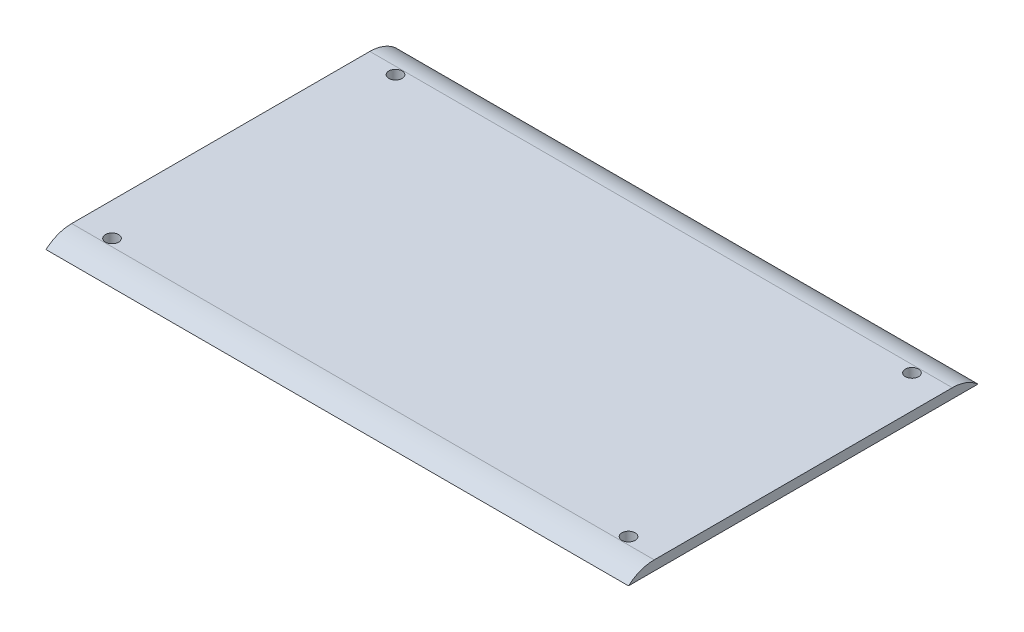
ISO-10303-21;
HEADER;
FILE_DESCRIPTION(('STEP AP214'),'2;1');
FILE_NAME('part.step','',(''),(''),'','','');
FILE_SCHEMA(('AUTOMOTIVE_DESIGN { 1 0 10303 214 1 1 1 1 }'));
ENDSEC;
DATA;
#1=APPLICATION_CONTEXT('core data for automotive mechanical design processes');
#2=APPLICATION_PROTOCOL_DEFINITION('international standard','automotive_design',2000,#1);
#3=PRODUCT_CONTEXT('',#1,'mechanical');
#4=PRODUCT('Part','Part','',(#3));
#5=PRODUCT_RELATED_PRODUCT_CATEGORY('part','',(#4));
#6=PRODUCT_DEFINITION_FORMATION('','',#4);
#7=PRODUCT_DEFINITION_CONTEXT('part definition',#1,'design');
#8=PRODUCT_DEFINITION('design','',#6,#7);
#9=PRODUCT_DEFINITION_SHAPE('','',#8);
#10=(LENGTH_UNIT() NAMED_UNIT(*) SI_UNIT(.MILLI.,.METRE.));
#11=(NAMED_UNIT(*) PLANE_ANGLE_UNIT() SI_UNIT($,.RADIAN.));
#12=(NAMED_UNIT(*) SI_UNIT($,.STERADIAN.) SOLID_ANGLE_UNIT());
#13=UNCERTAINTY_MEASURE_WITH_UNIT(LENGTH_MEASURE(1.E-05),#10,'distance_accuracy_value','');
#14=(GEOMETRIC_REPRESENTATION_CONTEXT(3) GLOBAL_UNCERTAINTY_ASSIGNED_CONTEXT((#13)) GLOBAL_UNIT_ASSIGNED_CONTEXT((#10,
#11,#12)) REPRESENTATION_CONTEXT('',''));
#15=CARTESIAN_POINT('',(0.,0.,0.));
#16=DIRECTION('',(0.,0.,1.));
#17=DIRECTION('',(1.,0.,0.));
#18=AXIS2_PLACEMENT_3D('',#15,#16,#17);
#19=CARTESIAN_POINT('',(0.,2.5,0.));
#20=DIRECTION('',(1.,0.,0.));
#21=DIRECTION('',(0.,0.,-1.));
#22=AXIS2_PLACEMENT_3D('',#19,#20,#21);
#23=PLANE('',#22);
#24=DIRECTION('',(0.,0.,1.));
#25=VECTOR('',#24,1.);
#26=CARTESIAN_POINT('',(0.,2.5,0.));
#27=LINE('',#26,#25);
#28=CARTESIAN_POINT('',(0.,2.5,-83.3856217223385));
#29=VERTEX_POINT('',#28);
#30=CARTESIAN_POINT('',(0.,2.5,-6.61437827766148));
#31=VERTEX_POINT('',#30);
#32=EDGE_CURVE('E108',#29,#31,#27,.T.);
#33=ORIENTED_EDGE('',*,*,#32,.F.);
#34=CARTESIAN_POINT('',(0.,-7.5,-83.3856217223385));
#35=DIRECTION('',(1.,0.,0.));
#36=DIRECTION('',(0.,0.,-1.));
#37=AXIS2_PLACEMENT_3D('',#34,#35,#36);
#38=CIRCLE('',#37,10.);
#39=CARTESIAN_POINT('',(0.,0.,-90.));
#40=VERTEX_POINT('',#39);
#41=EDGE_CURVE('E50',#29,#40,#38,.F.);
#42=ORIENTED_EDGE('',*,*,#41,.T.);
#43=DIRECTION('',(0.,0.,1.));
#44=VECTOR('',#43,1.);
#45=CARTESIAN_POINT('',(0.,0.,0.));
#46=LINE('',#45,#44);
#47=CARTESIAN_POINT('',(0.,0.,0.));
#48=VERTEX_POINT('',#47);
#49=EDGE_CURVE('E82',#40,#48,#46,.T.);
#50=ORIENTED_EDGE('',*,*,#49,.T.);
#51=CARTESIAN_POINT('',(0.,-7.5,-6.61437827766148));
#52=DIRECTION('',(1.,0.,0.));
#53=DIRECTION('',(0.,0.,-1.));
#54=AXIS2_PLACEMENT_3D('',#51,#52,#53);
#55=CIRCLE('',#54,10.);
#56=EDGE_CURVE('E95',#48,#31,#55,.F.);
#57=ORIENTED_EDGE('',*,*,#56,.T.);
#58=EDGE_LOOP('',(#33,#42,#50,#57));
#59=FACE_BOUND('',#58,.T.);
#60=ADVANCED_FACE('F39',(#59),#23,.F.);
#61=CARTESIAN_POINT('',(150.,2.5,0.));
#62=DIRECTION('',(-1.,0.,0.));
#63=DIRECTION('',(0.,0.,1.));
#64=AXIS2_PLACEMENT_3D('',#61,#62,#63);
#65=PLANE('',#64);
#66=DIRECTION('',(0.,0.,-1.));
#67=VECTOR('',#66,1.);
#68=CARTESIAN_POINT('',(150.,0.,0.));
#69=LINE('',#68,#67);
#70=CARTESIAN_POINT('',(150.,0.,0.));
#71=VERTEX_POINT('',#70);
#72=CARTESIAN_POINT('',(150.,0.,-90.));
#73=VERTEX_POINT('',#72);
#74=EDGE_CURVE('E84',#71,#73,#69,.T.);
#75=ORIENTED_EDGE('',*,*,#74,.T.);
#76=CARTESIAN_POINT('',(150.,-7.5,-83.3856217223385));
#77=DIRECTION('',(-1.,0.,0.));
#78=DIRECTION('',(0.,0.,1.));
#79=AXIS2_PLACEMENT_3D('',#76,#77,#78);
#80=CIRCLE('',#79,10.);
#81=CARTESIAN_POINT('',(150.,2.5,-83.3856217223385));
#82=VERTEX_POINT('',#81);
#83=EDGE_CURVE('E11',#73,#82,#80,.F.);
#84=ORIENTED_EDGE('',*,*,#83,.T.);
#85=DIRECTION('',(0.,0.,-1.));
#86=VECTOR('',#85,1.);
#87=CARTESIAN_POINT('',(150.,2.5,0.));
#88=LINE('',#87,#86);
#89=CARTESIAN_POINT('',(150.,2.5,-6.61437827766148));
#90=VERTEX_POINT('',#89);
#91=EDGE_CURVE('E106',#90,#82,#88,.T.);
#92=ORIENTED_EDGE('',*,*,#91,.F.);
#93=CARTESIAN_POINT('',(150.,-7.5,-6.61437827766148));
#94=DIRECTION('',(-1.,0.,0.));
#95=DIRECTION('',(0.,0.,1.));
#96=AXIS2_PLACEMENT_3D('',#93,#94,#95);
#97=CIRCLE('',#96,10.);
#98=EDGE_CURVE('E99',#90,#71,#97,.F.);
#99=ORIENTED_EDGE('',*,*,#98,.T.);
#100=EDGE_LOOP('',(#75,#84,#92,#99));
#101=FACE_BOUND('',#100,.T.);
#102=ADVANCED_FACE('F142',(#101),#65,.F.);
#103=CARTESIAN_POINT('',(0.,2.5,0.));
#104=DIRECTION('',(0.,-1.,0.));
#105=DIRECTION('',(0.,0.,-1.));
#106=AXIS2_PLACEMENT_3D('',#103,#104,#105);
#107=PLANE('',#106);
#108=CARTESIAN_POINT('',(8.5,2.5,-8.50000000000001));
#109=DIRECTION('',(0.,1.,0.));
#110=DIRECTION('',(0.,0.,1.));
#111=AXIS2_PLACEMENT_3D('',#108,#109,#110);
#112=CIRCLE('',#111,1.7);
#113=CARTESIAN_POINT('',(8.5,2.5,-6.80000000000001));
#114=VERTEX_POINT('',#113);
#115=EDGE_CURVE('E116',#114,#114,#112,.T.);
#116=ORIENTED_EDGE('',*,*,#115,.F.);
#117=EDGE_LOOP('',(#116));
#118=FACE_BOUND('',#117,.T.);
#119=CARTESIAN_POINT('',(141.5,2.5,-81.5));
#120=DIRECTION('',(0.,1.,0.));
#121=DIRECTION('',(0.,0.,1.));
#122=AXIS2_PLACEMENT_3D('',#119,#120,#121);
#123=CIRCLE('',#122,1.70000000000001);
#124=CARTESIAN_POINT('',(141.5,2.5,-79.8));
#125=VERTEX_POINT('',#124);
#126=EDGE_CURVE('E125',#125,#125,#123,.T.);
#127=ORIENTED_EDGE('',*,*,#126,.F.);
#128=EDGE_LOOP('',(#127));
#129=FACE_BOUND('',#128,.T.);
#130=CARTESIAN_POINT('',(141.5,2.5,-8.5));
#131=DIRECTION('',(0.,1.,0.));
#132=DIRECTION('',(0.,0.,1.));
#133=AXIS2_PLACEMENT_3D('',#130,#131,#132);
#134=CIRCLE('',#133,1.70000000000001);
#135=CARTESIAN_POINT('',(141.5,2.5,-6.79999999999999));
#136=VERTEX_POINT('',#135);
#137=EDGE_CURVE('E123',#136,#136,#134,.T.);
#138=ORIENTED_EDGE('',*,*,#137,.F.);
#139=EDGE_LOOP('',(#138));
#140=FACE_BOUND('',#139,.T.);
#141=CARTESIAN_POINT('',(8.5,2.5,-81.5));
#142=DIRECTION('',(0.,1.,0.));
#143=DIRECTION('',(0.,0.,1.));
#144=AXIS2_PLACEMENT_3D('',#141,#142,#143);
#145=CIRCLE('',#144,1.70000000000001);
#146=CARTESIAN_POINT('',(8.5,2.5,-79.8));
#147=VERTEX_POINT('',#146);
#148=EDGE_CURVE('E114',#147,#147,#145,.T.);
#149=ORIENTED_EDGE('',*,*,#148,.F.);
#150=EDGE_LOOP('',(#149));
#151=FACE_BOUND('',#150,.T.);
#152=ORIENTED_EDGE('',*,*,#91,.T.);
#153=DIRECTION('',(1.,0.,0.));
#154=VECTOR('',#153,1.);
#155=CARTESIAN_POINT('',(0.,2.5,-83.3856217223385));
#156=LINE('',#155,#154);
#157=EDGE_CURVE('E97',#82,#29,#156,.F.);
#158=ORIENTED_EDGE('',*,*,#157,.T.);
#159=ORIENTED_EDGE('',*,*,#32,.T.);
#160=DIRECTION('',(-1.,0.,0.));
#161=VECTOR('',#160,1.);
#162=CARTESIAN_POINT('',(0.,2.5,-6.61437827766148));
#163=LINE('',#162,#161);
#164=EDGE_CURVE('E98',#31,#90,#163,.F.);
#165=ORIENTED_EDGE('',*,*,#164,.T.);
#166=EDGE_LOOP('',(#152,#158,#159,#165));
#167=FACE_BOUND('',#166,.T.);
#168=ADVANCED_FACE('F137',(#118,#129,#140,#151,#167),#107,.F.);
#169=CARTESIAN_POINT('',(0.,0.,0.));
#170=DIRECTION('',(0.,-1.,0.));
#171=DIRECTION('',(0.,0.,-1.));
#172=AXIS2_PLACEMENT_3D('',#169,#170,#171);
#173=PLANE('',#172);
#174=CARTESIAN_POINT('',(8.5,0.,-8.50000000000001));
#175=DIRECTION('',(0.,1.,0.));
#176=DIRECTION('',(0.,0.,1.));
#177=AXIS2_PLACEMENT_3D('',#174,#175,#176);
#178=CIRCLE('',#177,1.7);
#179=CARTESIAN_POINT('',(8.5,0.,-6.80000000000001));
#180=VERTEX_POINT('',#179);
#181=EDGE_CURVE('E127',#180,#180,#178,.T.);
#182=ORIENTED_EDGE('',*,*,#181,.T.);
#183=EDGE_LOOP('',(#182));
#184=FACE_BOUND('',#183,.T.);
#185=CARTESIAN_POINT('',(141.5,0.,-81.5));
#186=DIRECTION('',(0.,1.,0.));
#187=DIRECTION('',(0.,0.,1.));
#188=AXIS2_PLACEMENT_3D('',#185,#186,#187);
#189=CIRCLE('',#188,1.70000000000001);
#190=CARTESIAN_POINT('',(141.5,0.,-79.8));
#191=VERTEX_POINT('',#190);
#192=EDGE_CURVE('E118',#191,#191,#189,.T.);
#193=ORIENTED_EDGE('',*,*,#192,.T.);
#194=EDGE_LOOP('',(#193));
#195=FACE_BOUND('',#194,.T.);
#196=CARTESIAN_POINT('',(141.5,0.,-8.5));
#197=DIRECTION('',(0.,1.,0.));
#198=DIRECTION('',(0.,0.,1.));
#199=AXIS2_PLACEMENT_3D('',#196,#197,#198);
#200=CIRCLE('',#199,1.70000000000001);
#201=CARTESIAN_POINT('',(141.5,0.,-6.79999999999999));
#202=VERTEX_POINT('',#201);
#203=EDGE_CURVE('E131',#202,#202,#200,.T.);
#204=ORIENTED_EDGE('',*,*,#203,.T.);
#205=EDGE_LOOP('',(#204));
#206=FACE_BOUND('',#205,.T.);
#207=CARTESIAN_POINT('',(8.5,0.,-81.5));
#208=DIRECTION('',(0.,1.,0.));
#209=DIRECTION('',(0.,0.,1.));
#210=AXIS2_PLACEMENT_3D('',#207,#208,#209);
#211=CIRCLE('',#210,1.70000000000001);
#212=CARTESIAN_POINT('',(8.5,0.,-79.8));
#213=VERTEX_POINT('',#212);
#214=EDGE_CURVE('E94',#213,#213,#211,.T.);
#215=ORIENTED_EDGE('',*,*,#214,.T.);
#216=EDGE_LOOP('',(#215));
#217=FACE_BOUND('',#216,.T.);
#218=ORIENTED_EDGE('',*,*,#49,.F.);
#219=DIRECTION('',(-1.,0.,0.));
#220=VECTOR('',#219,1.);
#221=CARTESIAN_POINT('',(0.,0.,-90.));
#222=LINE('',#221,#220);
#223=EDGE_CURVE('E110',#73,#40,#222,.T.);
#224=ORIENTED_EDGE('',*,*,#223,.F.);
#225=ORIENTED_EDGE('',*,*,#74,.F.);
#226=DIRECTION('',(1.,0.,0.));
#227=VECTOR('',#226,1.);
#228=CARTESIAN_POINT('',(0.,0.,0.));
#229=LINE('',#228,#227);
#230=EDGE_CURVE('E80',#48,#71,#229,.T.);
#231=ORIENTED_EDGE('',*,*,#230,.F.);
#232=EDGE_LOOP('',(#218,#224,#225,#231));
#233=FACE_BOUND('',#232,.T.);
#234=ADVANCED_FACE('F85',(#184,#195,#206,#217,#233),#173,.T.);
#235=CARTESIAN_POINT('',(0.,-7.5,-6.61437827766148));
#236=DIRECTION('',(-1.,0.,0.));
#237=DIRECTION('',(0.,0.,1.));
#238=AXIS2_PLACEMENT_3D('',#235,#236,#237);
#239=CYLINDRICAL_SURFACE('',#238,10.);
#240=ORIENTED_EDGE('',*,*,#56,.F.);
#241=ORIENTED_EDGE('',*,*,#230,.T.);
#242=ORIENTED_EDGE('',*,*,#98,.F.);
#243=ORIENTED_EDGE('',*,*,#164,.F.);
#244=EDGE_LOOP('',(#240,#241,#242,#243));
#245=FACE_BOUND('',#244,.T.);
#246=ADVANCED_FACE('F96',(#245),#239,.T.);
#247=CARTESIAN_POINT('',(0.,-7.5,-83.3856217223385));
#248=DIRECTION('',(1.,0.,0.));
#249=DIRECTION('',(0.,0.,-1.));
#250=AXIS2_PLACEMENT_3D('',#247,#248,#249);
#251=CYLINDRICAL_SURFACE('',#250,10.);
#252=ORIENTED_EDGE('',*,*,#83,.F.);
#253=ORIENTED_EDGE('',*,*,#223,.T.);
#254=ORIENTED_EDGE('',*,*,#41,.F.);
#255=ORIENTED_EDGE('',*,*,#157,.F.);
#256=EDGE_LOOP('',(#252,#253,#254,#255));
#257=FACE_BOUND('',#256,.T.);
#258=ADVANCED_FACE('F41',(#257),#251,.T.);
#259=CARTESIAN_POINT('',(8.5,0.,-81.5));
#260=DIRECTION('',(0.,1.,0.));
#261=DIRECTION('',(0.,0.,1.));
#262=AXIS2_PLACEMENT_3D('',#259,#260,#261);
#263=CYLINDRICAL_SURFACE('',#262,1.70000000000001);
#264=ORIENTED_EDGE('',*,*,#214,.F.);
#265=EDGE_LOOP('',(#264));
#266=FACE_BOUND('',#265,.T.);
#267=ORIENTED_EDGE('',*,*,#148,.T.);
#268=EDGE_LOOP('',(#267));
#269=FACE_BOUND('',#268,.T.);
#270=ADVANCED_FACE('F146',(#266,#269),#263,.F.);
#271=CARTESIAN_POINT('',(141.5,0.,-8.5));
#272=DIRECTION('',(0.,1.,0.));
#273=DIRECTION('',(0.,0.,1.));
#274=AXIS2_PLACEMENT_3D('',#271,#272,#273);
#275=CYLINDRICAL_SURFACE('',#274,1.70000000000001);
#276=ORIENTED_EDGE('',*,*,#203,.F.);
#277=EDGE_LOOP('',(#276));
#278=FACE_BOUND('',#277,.T.);
#279=ORIENTED_EDGE('',*,*,#137,.T.);
#280=EDGE_LOOP('',(#279));
#281=FACE_BOUND('',#280,.T.);
#282=ADVANCED_FACE('F140',(#278,#281),#275,.F.);
#283=CARTESIAN_POINT('',(141.5,0.,-81.5));
#284=DIRECTION('',(0.,1.,0.));
#285=DIRECTION('',(0.,0.,1.));
#286=AXIS2_PLACEMENT_3D('',#283,#284,#285);
#287=CYLINDRICAL_SURFACE('',#286,1.70000000000001);
#288=ORIENTED_EDGE('',*,*,#192,.F.);
#289=EDGE_LOOP('',(#288));
#290=FACE_BOUND('',#289,.T.);
#291=ORIENTED_EDGE('',*,*,#126,.T.);
#292=EDGE_LOOP('',(#291));
#293=FACE_BOUND('',#292,.T.);
#294=ADVANCED_FACE('F164',(#290,#293),#287,.F.);
#295=CARTESIAN_POINT('',(8.5,0.,-8.50000000000001));
#296=DIRECTION('',(0.,1.,0.));
#297=DIRECTION('',(0.,0.,1.));
#298=AXIS2_PLACEMENT_3D('',#295,#296,#297);
#299=CYLINDRICAL_SURFACE('',#298,1.7);
#300=ORIENTED_EDGE('',*,*,#181,.F.);
#301=EDGE_LOOP('',(#300));
#302=FACE_BOUND('',#301,.T.);
#303=ORIENTED_EDGE('',*,*,#115,.T.);
#304=EDGE_LOOP('',(#303));
#305=FACE_BOUND('',#304,.T.);
#306=ADVANCED_FACE('F169',(#302,#305),#299,.F.);
#307=CLOSED_SHELL('',(#60,#102,#168,#234,#246,#258,#270,#282,#294,#306));
#308=MANIFOLD_SOLID_BREP('B2',#307);
#309=ADVANCED_BREP_SHAPE_REPRESENTATION('',(#18,#308),#14);
#310=SHAPE_DEFINITION_REPRESENTATION(#9,#309);
ENDSEC;
END-ISO-10303-21;
